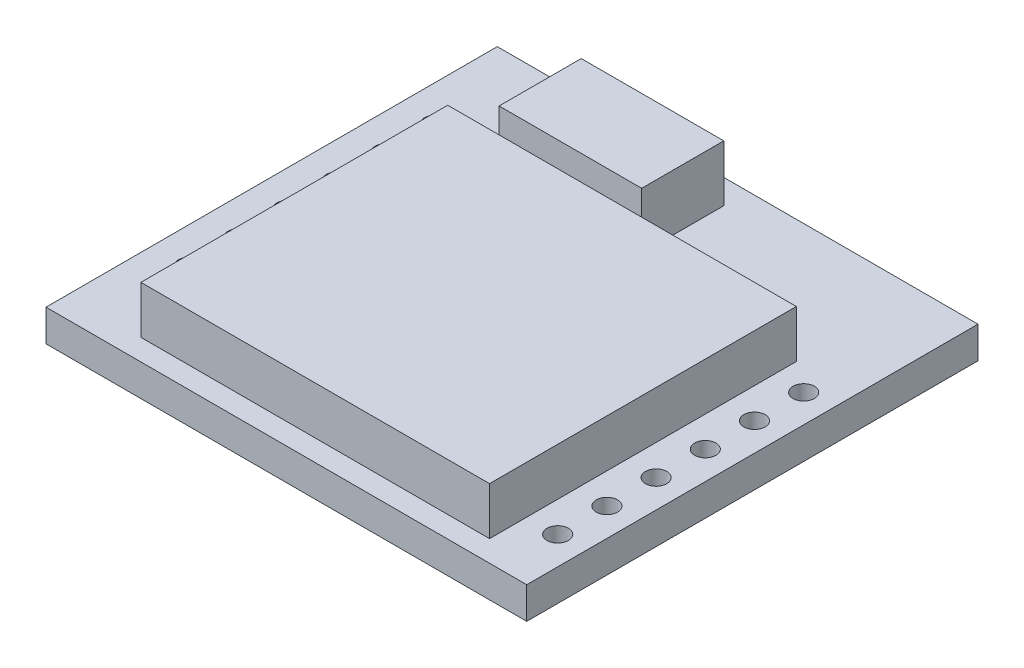
ISO-10303-21;
HEADER;
FILE_DESCRIPTION(('STEP AP214'),'2;1');
FILE_NAME('part.step','',(''),(''),'','','');
FILE_SCHEMA(('AUTOMOTIVE_DESIGN { 1 0 10303 214 1 1 1 1 }'));
ENDSEC;
DATA;
#1=APPLICATION_CONTEXT('core data for automotive mechanical design processes');
#2=APPLICATION_PROTOCOL_DEFINITION('international standard','automotive_design',2000,#1);
#3=PRODUCT_CONTEXT('',#1,'mechanical');
#4=PRODUCT('Part','Part','',(#3));
#5=PRODUCT_RELATED_PRODUCT_CATEGORY('part','',(#4));
#6=PRODUCT_DEFINITION_FORMATION('','',#4);
#7=PRODUCT_DEFINITION_CONTEXT('part definition',#1,'design');
#8=PRODUCT_DEFINITION('design','',#6,#7);
#9=PRODUCT_DEFINITION_SHAPE('','',#8);
#10=(LENGTH_UNIT() NAMED_UNIT(*) SI_UNIT(.MILLI.,.METRE.));
#11=(NAMED_UNIT(*) PLANE_ANGLE_UNIT() SI_UNIT($,.RADIAN.));
#12=(NAMED_UNIT(*) SI_UNIT($,.STERADIAN.) SOLID_ANGLE_UNIT());
#13=UNCERTAINTY_MEASURE_WITH_UNIT(LENGTH_MEASURE(1.E-05),#10,'distance_accuracy_value','');
#14=(GEOMETRIC_REPRESENTATION_CONTEXT(3) GLOBAL_UNCERTAINTY_ASSIGNED_CONTEXT((#13)) GLOBAL_UNIT_ASSIGNED_CONTEXT((#10,
#11,#12)) REPRESENTATION_CONTEXT('',''));
#15=CARTESIAN_POINT('',(0.,0.,0.));
#16=DIRECTION('',(0.,0.,1.));
#17=DIRECTION('',(1.,0.,0.));
#18=AXIS2_PLACEMENT_3D('',#15,#16,#17);
#19=CARTESIAN_POINT('',(0.,0.,0.));
#20=DIRECTION('',(0.,-1.,0.));
#21=DIRECTION('',(0.,0.,-1.));
#22=AXIS2_PLACEMENT_3D('',#19,#20,#21);
#23=PLANE('',#22);
#24=CARTESIAN_POINT('',(23.37,0.,-15.75));
#25=DIRECTION('',(0.,1.,0.));
#26=DIRECTION('',(0.,0.,1.));
#27=AXIS2_PLACEMENT_3D('',#24,#25,#26);
#28=CIRCLE('',#27,0.55);
#29=CARTESIAN_POINT('',(23.37,0.,-15.2));
#30=VERTEX_POINT('',#29);
#31=EDGE_CURVE('E333',#30,#30,#28,.T.);
#32=ORIENTED_EDGE('',*,*,#31,.T.);
#33=EDGE_LOOP('',(#32));
#34=FACE_BOUND('',#33,.T.);
#35=CARTESIAN_POINT('',(23.37,0.,-13.21));
#36=DIRECTION('',(0.,1.,0.));
#37=DIRECTION('',(0.,0.,1.));
#38=AXIS2_PLACEMENT_3D('',#35,#36,#37);
#39=CIRCLE('',#38,0.55);
#40=CARTESIAN_POINT('',(23.37,0.,-12.66));
#41=VERTEX_POINT('',#40);
#42=EDGE_CURVE('E321',#41,#41,#39,.T.);
#43=ORIENTED_EDGE('',*,*,#42,.T.);
#44=EDGE_LOOP('',(#43));
#45=FACE_BOUND('',#44,.T.);
#46=CARTESIAN_POINT('',(23.37,0.,-10.67));
#47=DIRECTION('',(0.,1.,0.));
#48=DIRECTION('',(0.,0.,1.));
#49=AXIS2_PLACEMENT_3D('',#46,#47,#48);
#50=CIRCLE('',#49,0.55);
#51=CARTESIAN_POINT('',(23.37,0.,-10.12));
#52=VERTEX_POINT('',#51);
#53=EDGE_CURVE('E309',#52,#52,#50,.T.);
#54=ORIENTED_EDGE('',*,*,#53,.T.);
#55=EDGE_LOOP('',(#54));
#56=FACE_BOUND('',#55,.T.);
#57=CARTESIAN_POINT('',(23.37,0.,-8.13));
#58=DIRECTION('',(0.,1.,0.));
#59=DIRECTION('',(0.,0.,1.));
#60=AXIS2_PLACEMENT_3D('',#57,#58,#59);
#61=CIRCLE('',#60,0.549999999999999);
#62=CARTESIAN_POINT('',(23.37,0.,-7.58));
#63=VERTEX_POINT('',#62);
#64=EDGE_CURVE('E297',#63,#63,#61,.T.);
#65=ORIENTED_EDGE('',*,*,#64,.T.);
#66=EDGE_LOOP('',(#65));
#67=FACE_BOUND('',#66,.T.);
#68=CARTESIAN_POINT('',(23.37,0.,-5.59));
#69=DIRECTION('',(0.,1.,0.));
#70=DIRECTION('',(0.,0.,1.));
#71=AXIS2_PLACEMENT_3D('',#68,#69,#70);
#72=CIRCLE('',#71,0.549999999999999);
#73=CARTESIAN_POINT('',(23.37,0.,-5.04));
#74=VERTEX_POINT('',#73);
#75=EDGE_CURVE('E285',#74,#74,#72,.T.);
#76=ORIENTED_EDGE('',*,*,#75,.T.);
#77=EDGE_LOOP('',(#76));
#78=FACE_BOUND('',#77,.T.);
#79=CARTESIAN_POINT('',(23.37,0.,-3.05));
#80=DIRECTION('',(0.,1.,0.));
#81=DIRECTION('',(0.,0.,1.));
#82=AXIS2_PLACEMENT_3D('',#79,#80,#81);
#83=CIRCLE('',#82,0.549999999999999);
#84=CARTESIAN_POINT('',(23.37,0.,-2.5));
#85=VERTEX_POINT('',#84);
#86=EDGE_CURVE('E273',#85,#85,#83,.T.);
#87=ORIENTED_EDGE('',*,*,#86,.T.);
#88=EDGE_LOOP('',(#87));
#89=FACE_BOUND('',#88,.T.);
#90=CARTESIAN_POINT('',(1.85,0.,-5.55));
#91=DIRECTION('',(0.,1.,0.));
#92=DIRECTION('',(0.,0.,1.));
#93=AXIS2_PLACEMENT_3D('',#90,#91,#92);
#94=CIRCLE('',#93,0.55);
#95=CARTESIAN_POINT('',(1.85,0.,-5.));
#96=VERTEX_POINT('',#95);
#97=EDGE_CURVE('E267',#96,#96,#94,.T.);
#98=ORIENTED_EDGE('',*,*,#97,.T.);
#99=EDGE_LOOP('',(#98));
#100=FACE_BOUND('',#99,.T.);
#101=CARTESIAN_POINT('',(1.84999999999999,0.,-8.09));
#102=DIRECTION('',(0.,1.,0.));
#103=DIRECTION('',(0.,0.,1.));
#104=AXIS2_PLACEMENT_3D('',#101,#102,#103);
#105=CIRCLE('',#104,0.55);
#106=CARTESIAN_POINT('',(1.84999999999999,0.,-7.54));
#107=VERTEX_POINT('',#106);
#108=EDGE_CURVE('E279',#107,#107,#105,.T.);
#109=ORIENTED_EDGE('',*,*,#108,.T.);
#110=EDGE_LOOP('',(#109));
#111=FACE_BOUND('',#110,.T.);
#112=CARTESIAN_POINT('',(1.84999999999998,0.,-10.63));
#113=DIRECTION('',(0.,1.,0.));
#114=DIRECTION('',(0.,0.,1.));
#115=AXIS2_PLACEMENT_3D('',#112,#113,#114);
#116=CIRCLE('',#115,0.549999999999999);
#117=CARTESIAN_POINT('',(1.84999999999998,0.,-10.08));
#118=VERTEX_POINT('',#117);
#119=EDGE_CURVE('E291',#118,#118,#116,.T.);
#120=ORIENTED_EDGE('',*,*,#119,.T.);
#121=EDGE_LOOP('',(#120));
#122=FACE_BOUND('',#121,.T.);
#123=CARTESIAN_POINT('',(1.84999999999997,0.,-13.17));
#124=DIRECTION('',(0.,1.,0.));
#125=DIRECTION('',(0.,0.,1.));
#126=AXIS2_PLACEMENT_3D('',#123,#124,#125);
#127=CIRCLE('',#126,0.55);
#128=CARTESIAN_POINT('',(1.84999999999997,0.,-12.62));
#129=VERTEX_POINT('',#128);
#130=EDGE_CURVE('E303',#129,#129,#127,.T.);
#131=ORIENTED_EDGE('',*,*,#130,.T.);
#132=EDGE_LOOP('',(#131));
#133=FACE_BOUND('',#132,.T.);
#134=CARTESIAN_POINT('',(1.84999999999996,0.,-15.71));
#135=DIRECTION('',(0.,1.,0.));
#136=DIRECTION('',(0.,0.,1.));
#137=AXIS2_PLACEMENT_3D('',#134,#135,#136);
#138=CIRCLE('',#137,0.549999999999999);
#139=CARTESIAN_POINT('',(1.84999999999996,0.,-15.16));
#140=VERTEX_POINT('',#139);
#141=EDGE_CURVE('E315',#140,#140,#138,.T.);
#142=ORIENTED_EDGE('',*,*,#141,.T.);
#143=EDGE_LOOP('',(#142));
#144=FACE_BOUND('',#143,.T.);
#145=CARTESIAN_POINT('',(1.84999999999996,0.,-18.25));
#146=DIRECTION('',(0.,1.,0.));
#147=DIRECTION('',(0.,0.,1.));
#148=AXIS2_PLACEMENT_3D('',#145,#146,#147);
#149=CIRCLE('',#148,0.549999999999999);
#150=CARTESIAN_POINT('',(1.84999999999996,0.,-17.7));
#151=VERTEX_POINT('',#150);
#152=EDGE_CURVE('E327',#151,#151,#149,.T.);
#153=ORIENTED_EDGE('',*,*,#152,.T.);
#154=EDGE_LOOP('',(#153));
#155=FACE_BOUND('',#154,.T.);
#156=DIRECTION('',(-1.,0.,0.));
#157=VECTOR('',#156,1.);
#158=CARTESIAN_POINT('',(0.,0.,-6.20000000000001));
#159=LINE('',#158,#157);
#160=CARTESIAN_POINT('',(20.22,0.,-6.2));
#161=VERTEX_POINT('',#160);
#162=CARTESIAN_POINT('',(15.72,0.,-6.2));
#163=VERTEX_POINT('',#162);
#164=EDGE_CURVE('E204',#161,#163,#159,.T.);
#165=ORIENTED_EDGE('',*,*,#164,.F.);
#166=DIRECTION('',(0.,0.,-1.));
#167=VECTOR('',#166,1.);
#168=CARTESIAN_POINT('',(20.22,0.,0.));
#169=LINE('',#168,#167);
#170=CARTESIAN_POINT('',(20.22,0.,-23.3));
#171=VERTEX_POINT('',#170);
#172=EDGE_CURVE('E174',#161,#171,#169,.T.);
#173=ORIENTED_EDGE('',*,*,#172,.T.);
#174=DIRECTION('',(-1.,0.,0.));
#175=VECTOR('',#174,1.);
#176=CARTESIAN_POINT('',(0.,0.,-23.3));
#177=LINE('',#176,#175);
#178=CARTESIAN_POINT('',(24.82,0.,-23.3));
#179=VERTEX_POINT('',#178);
#180=EDGE_CURVE('E228',#179,#171,#177,.T.);
#181=ORIENTED_EDGE('',*,*,#180,.F.);
#182=DIRECTION('',(0.,0.,-1.));
#183=VECTOR('',#182,1.);
#184=CARTESIAN_POINT('',(24.82,0.,0.));
#185=LINE('',#184,#183);
#186=CARTESIAN_POINT('',(24.82,0.,0.));
#187=VERTEX_POINT('',#186);
#188=EDGE_CURVE('E229',#187,#179,#185,.T.);
#189=ORIENTED_EDGE('',*,*,#188,.F.);
#190=DIRECTION('',(1.,0.,0.));
#191=VECTOR('',#190,1.);
#192=CARTESIAN_POINT('',(0.,0.,0.));
#193=LINE('',#192,#191);
#194=CARTESIAN_POINT('',(0.,0.,0.));
#195=VERTEX_POINT('',#194);
#196=EDGE_CURVE('E253',#195,#187,#193,.T.);
#197=ORIENTED_EDGE('',*,*,#196,.F.);
#198=DIRECTION('',(0.,0.,1.));
#199=VECTOR('',#198,1.);
#200=CARTESIAN_POINT('',(0.,0.,0.));
#201=LINE('',#200,#199);
#202=CARTESIAN_POINT('',(0.,0.,-23.3));
#203=VERTEX_POINT('',#202);
#204=EDGE_CURVE('E255',#203,#195,#201,.T.);
#205=ORIENTED_EDGE('',*,*,#204,.F.);
#206=CARTESIAN_POINT('',(4.92,0.,-23.3));
#207=VERTEX_POINT('',#206);
#208=EDGE_CURVE('E225',#207,#203,#177,.T.);
#209=ORIENTED_EDGE('',*,*,#208,.F.);
#210=DIRECTION('',(0.,0.,-1.));
#211=VECTOR('',#210,1.);
#212=CARTESIAN_POINT('',(4.92,0.,0.));
#213=LINE('',#212,#211);
#214=CARTESIAN_POINT('',(4.92,0.,-7.6));
#215=VERTEX_POINT('',#214);
#216=EDGE_CURVE('E58',#215,#207,#213,.T.);
#217=ORIENTED_EDGE('',*,*,#216,.F.);
#218=DIRECTION('',(1.,0.,0.));
#219=VECTOR('',#218,1.);
#220=CARTESIAN_POINT('',(0.,0.,-7.6));
#221=LINE('',#220,#219);
#222=CARTESIAN_POINT('',(15.72,0.,-7.6));
#223=VERTEX_POINT('',#222);
#224=EDGE_CURVE('E63',#215,#223,#221,.T.);
#225=ORIENTED_EDGE('',*,*,#224,.T.);
#226=DIRECTION('',(0.,0.,1.));
#227=VECTOR('',#226,1.);
#228=CARTESIAN_POINT('',(15.72,0.,0.));
#229=LINE('',#228,#227);
#230=EDGE_CURVE('E206',#223,#163,#229,.T.);
#231=ORIENTED_EDGE('',*,*,#230,.T.);
#232=EDGE_LOOP('',(#165,#173,#181,#189,#197,#205,#209,#217,#225,#231));
#233=FACE_BOUND('',#232,.T.);
#234=ADVANCED_FACE('F41',(#34,#45,#56,#67,#78,#89,#100,#111,#122,#133,#144,#155,#233),#23,.T.);
#235=CARTESIAN_POINT('',(0.,1.64,0.));
#236=DIRECTION('',(0.,-1.,0.));
#237=DIRECTION('',(0.,0.,-1.));
#238=AXIS2_PLACEMENT_3D('',#235,#236,#237);
#239=PLANE('',#238);
#240=DIRECTION('',(0.,0.,1.));
#241=VECTOR('',#240,1.);
#242=CARTESIAN_POINT('',(3.8,1.64,-16.94));
#243=LINE('',#242,#241);
#244=CARTESIAN_POINT('',(3.8,1.64,-16.94));
#245=VERTEX_POINT('',#244);
#246=CARTESIAN_POINT('',(3.8,1.64,-1.1));
#247=VERTEX_POINT('',#246);
#248=EDGE_CURVE('E361',#245,#247,#243,.T.);
#249=ORIENTED_EDGE('',*,*,#248,.F.);
#250=DIRECTION('',(-1.,0.,0.));
#251=VECTOR('',#250,1.);
#252=CARTESIAN_POINT('',(3.8,1.64,-16.94));
#253=LINE('',#252,#251);
#254=CARTESIAN_POINT('',(21.8,1.64,-16.94));
#255=VERTEX_POINT('',#254);
#256=EDGE_CURVE('E351',#255,#245,#253,.T.);
#257=ORIENTED_EDGE('',*,*,#256,.F.);
#258=DIRECTION('',(0.,0.,-1.));
#259=VECTOR('',#258,1.);
#260=CARTESIAN_POINT('',(21.8,1.64,-16.94));
#261=LINE('',#260,#259);
#262=CARTESIAN_POINT('',(21.8,1.64,-1.1));
#263=VERTEX_POINT('',#262);
#264=EDGE_CURVE('E355',#263,#255,#261,.T.);
#265=ORIENTED_EDGE('',*,*,#264,.F.);
#266=DIRECTION('',(1.,0.,0.));
#267=VECTOR('',#266,1.);
#268=CARTESIAN_POINT('',(3.8,1.64,-1.1));
#269=LINE('',#268,#267);
#270=EDGE_CURVE('E358',#247,#263,#269,.T.);
#271=ORIENTED_EDGE('',*,*,#270,.F.);
#272=EDGE_LOOP('',(#249,#257,#265,#271));
#273=FACE_BOUND('',#272,.T.);
#274=CARTESIAN_POINT('',(1.84999999999996,1.64,-18.25));
#275=DIRECTION('',(0.,1.,0.));
#276=DIRECTION('',(0.,0.,1.));
#277=AXIS2_PLACEMENT_3D('',#274,#275,#276);
#278=CIRCLE('',#277,0.549999999999999);
#279=CARTESIAN_POINT('',(1.84999999999996,1.64,-17.7));
#280=VERTEX_POINT('',#279);
#281=EDGE_CURVE('E324',#280,#280,#278,.T.);
#282=ORIENTED_EDGE('',*,*,#281,.F.);
#283=EDGE_LOOP('',(#282));
#284=FACE_BOUND('',#283,.T.);
#285=CARTESIAN_POINT('',(1.84999999999996,1.64,-15.71));
#286=DIRECTION('',(0.,1.,0.));
#287=DIRECTION('',(0.,0.,1.));
#288=AXIS2_PLACEMENT_3D('',#285,#286,#287);
#289=CIRCLE('',#288,0.549999999999999);
#290=CARTESIAN_POINT('',(1.84999999999996,1.64,-15.16));
#291=VERTEX_POINT('',#290);
#292=EDGE_CURVE('E312',#291,#291,#289,.T.);
#293=ORIENTED_EDGE('',*,*,#292,.F.);
#294=EDGE_LOOP('',(#293));
#295=FACE_BOUND('',#294,.T.);
#296=CARTESIAN_POINT('',(1.84999999999997,1.64,-13.17));
#297=DIRECTION('',(0.,1.,0.));
#298=DIRECTION('',(0.,0.,1.));
#299=AXIS2_PLACEMENT_3D('',#296,#297,#298);
#300=CIRCLE('',#299,0.55);
#301=CARTESIAN_POINT('',(1.84999999999997,1.64,-12.62));
#302=VERTEX_POINT('',#301);
#303=EDGE_CURVE('E300',#302,#302,#300,.T.);
#304=ORIENTED_EDGE('',*,*,#303,.F.);
#305=EDGE_LOOP('',(#304));
#306=FACE_BOUND('',#305,.T.);
#307=CARTESIAN_POINT('',(1.84999999999998,1.64,-10.63));
#308=DIRECTION('',(0.,1.,0.));
#309=DIRECTION('',(0.,0.,1.));
#310=AXIS2_PLACEMENT_3D('',#307,#308,#309);
#311=CIRCLE('',#310,0.549999999999999);
#312=CARTESIAN_POINT('',(1.84999999999998,1.64,-10.08));
#313=VERTEX_POINT('',#312);
#314=EDGE_CURVE('E288',#313,#313,#311,.T.);
#315=ORIENTED_EDGE('',*,*,#314,.F.);
#316=EDGE_LOOP('',(#315));
#317=FACE_BOUND('',#316,.T.);
#318=CARTESIAN_POINT('',(1.84999999999999,1.64,-8.09));
#319=DIRECTION('',(0.,1.,0.));
#320=DIRECTION('',(0.,0.,1.));
#321=AXIS2_PLACEMENT_3D('',#318,#319,#320);
#322=CIRCLE('',#321,0.55);
#323=CARTESIAN_POINT('',(1.84999999999999,1.64,-7.54));
#324=VERTEX_POINT('',#323);
#325=EDGE_CURVE('E276',#324,#324,#322,.T.);
#326=ORIENTED_EDGE('',*,*,#325,.F.);
#327=EDGE_LOOP('',(#326));
#328=FACE_BOUND('',#327,.T.);
#329=CARTESIAN_POINT('',(1.85,1.64,-5.55));
#330=DIRECTION('',(0.,1.,0.));
#331=DIRECTION('',(0.,0.,1.));
#332=AXIS2_PLACEMENT_3D('',#329,#330,#331);
#333=CIRCLE('',#332,0.55);
#334=CARTESIAN_POINT('',(1.85,1.64,-5.));
#335=VERTEX_POINT('',#334);
#336=EDGE_CURVE('E257',#335,#335,#333,.T.);
#337=ORIENTED_EDGE('',*,*,#336,.F.);
#338=EDGE_LOOP('',(#337));
#339=FACE_BOUND('',#338,.T.);
#340=DIRECTION('',(0.,0.,1.));
#341=VECTOR('',#340,1.);
#342=CARTESIAN_POINT('',(0.,1.64,0.));
#343=LINE('',#342,#341);
#344=CARTESIAN_POINT('',(0.,1.64,-23.3));
#345=VERTEX_POINT('',#344);
#346=CARTESIAN_POINT('',(0.,1.64,0.));
#347=VERTEX_POINT('',#346);
#348=EDGE_CURVE('E264',#345,#347,#343,.T.);
#349=ORIENTED_EDGE('',*,*,#348,.T.);
#350=DIRECTION('',(1.,0.,0.));
#351=VECTOR('',#350,1.);
#352=CARTESIAN_POINT('',(0.,1.64,0.));
#353=LINE('',#352,#351);
#354=CARTESIAN_POINT('',(24.82,1.64,0.));
#355=VERTEX_POINT('',#354);
#356=EDGE_CURVE('E262',#347,#355,#353,.T.);
#357=ORIENTED_EDGE('',*,*,#356,.T.);
#358=DIRECTION('',(0.,0.,-1.));
#359=VECTOR('',#358,1.);
#360=CARTESIAN_POINT('',(24.82,1.64,0.));
#361=LINE('',#360,#359);
#362=CARTESIAN_POINT('',(24.82,1.64,-23.3));
#363=VERTEX_POINT('',#362);
#364=EDGE_CURVE('E249',#355,#363,#361,.T.);
#365=ORIENTED_EDGE('',*,*,#364,.T.);
#366=DIRECTION('',(-1.,0.,0.));
#367=VECTOR('',#366,1.);
#368=CARTESIAN_POINT('',(0.,1.64,-23.3));
#369=LINE('',#368,#367);
#370=EDGE_CURVE('E239',#363,#345,#369,.T.);
#371=ORIENTED_EDGE('',*,*,#370,.T.);
#372=EDGE_LOOP('',(#349,#357,#365,#371));
#373=FACE_BOUND('',#372,.T.);
#374=CARTESIAN_POINT('',(23.37,1.64,-3.05));
#375=DIRECTION('',(0.,1.,0.));
#376=DIRECTION('',(0.,0.,1.));
#377=AXIS2_PLACEMENT_3D('',#374,#375,#376);
#378=CIRCLE('',#377,0.549999999999999);
#379=CARTESIAN_POINT('',(23.37,1.64,-2.5));
#380=VERTEX_POINT('',#379);
#381=EDGE_CURVE('E270',#380,#380,#378,.T.);
#382=ORIENTED_EDGE('',*,*,#381,.F.);
#383=EDGE_LOOP('',(#382));
#384=FACE_BOUND('',#383,.T.);
#385=CARTESIAN_POINT('',(23.37,1.64,-5.59));
#386=DIRECTION('',(0.,1.,0.));
#387=DIRECTION('',(0.,0.,1.));
#388=AXIS2_PLACEMENT_3D('',#385,#386,#387);
#389=CIRCLE('',#388,0.549999999999999);
#390=CARTESIAN_POINT('',(23.37,1.64,-5.04));
#391=VERTEX_POINT('',#390);
#392=EDGE_CURVE('E282',#391,#391,#389,.T.);
#393=ORIENTED_EDGE('',*,*,#392,.F.);
#394=EDGE_LOOP('',(#393));
#395=FACE_BOUND('',#394,.T.);
#396=CARTESIAN_POINT('',(23.37,1.64,-8.13));
#397=DIRECTION('',(0.,1.,0.));
#398=DIRECTION('',(0.,0.,1.));
#399=AXIS2_PLACEMENT_3D('',#396,#397,#398);
#400=CIRCLE('',#399,0.549999999999999);
#401=CARTESIAN_POINT('',(23.37,1.64,-7.58));
#402=VERTEX_POINT('',#401);
#403=EDGE_CURVE('E294',#402,#402,#400,.T.);
#404=ORIENTED_EDGE('',*,*,#403,.F.);
#405=EDGE_LOOP('',(#404));
#406=FACE_BOUND('',#405,.T.);
#407=CARTESIAN_POINT('',(23.37,1.64,-10.67));
#408=DIRECTION('',(0.,1.,0.));
#409=DIRECTION('',(0.,0.,1.));
#410=AXIS2_PLACEMENT_3D('',#407,#408,#409);
#411=CIRCLE('',#410,0.55);
#412=CARTESIAN_POINT('',(23.37,1.64,-10.12));
#413=VERTEX_POINT('',#412);
#414=EDGE_CURVE('E306',#413,#413,#411,.T.);
#415=ORIENTED_EDGE('',*,*,#414,.F.);
#416=EDGE_LOOP('',(#415));
#417=FACE_BOUND('',#416,.T.);
#418=CARTESIAN_POINT('',(23.37,1.64,-13.21));
#419=DIRECTION('',(0.,1.,0.));
#420=DIRECTION('',(0.,0.,1.));
#421=AXIS2_PLACEMENT_3D('',#418,#419,#420);
#422=CIRCLE('',#421,0.55);
#423=CARTESIAN_POINT('',(23.37,1.64,-12.66));
#424=VERTEX_POINT('',#423);
#425=EDGE_CURVE('E318',#424,#424,#422,.T.);
#426=ORIENTED_EDGE('',*,*,#425,.F.);
#427=EDGE_LOOP('',(#426));
#428=FACE_BOUND('',#427,.T.);
#429=CARTESIAN_POINT('',(23.37,1.64,-15.75));
#430=DIRECTION('',(0.,1.,0.));
#431=DIRECTION('',(0.,0.,1.));
#432=AXIS2_PLACEMENT_3D('',#429,#430,#431);
#433=CIRCLE('',#432,0.55);
#434=CARTESIAN_POINT('',(23.37,1.64,-15.2));
#435=VERTEX_POINT('',#434);
#436=EDGE_CURVE('E330',#435,#435,#433,.T.);
#437=ORIENTED_EDGE('',*,*,#436,.F.);
#438=EDGE_LOOP('',(#437));
#439=FACE_BOUND('',#438,.T.);
#440=DIRECTION('',(0.,0.,1.));
#441=VECTOR('',#440,1.);
#442=CARTESIAN_POINT('',(5.60140526925351,1.64,-22.0343415862834));
#443=LINE('',#442,#441);
#444=CARTESIAN_POINT('',(5.60140526925351,1.64,-22.0343415862834));
#445=VERTEX_POINT('',#444);
#446=CARTESIAN_POINT('',(5.60140526925351,1.64,-17.7943415862834));
#447=VERTEX_POINT('',#446);
#448=EDGE_CURVE('E177',#445,#447,#443,.T.);
#449=ORIENTED_EDGE('',*,*,#448,.F.);
#450=DIRECTION('',(-1.,0.,0.));
#451=VECTOR('',#450,1.);
#452=CARTESIAN_POINT('',(5.60140526925351,1.64,-22.0343415862834));
#453=LINE('',#452,#451);
#454=CARTESIAN_POINT('',(12.9614052692535,1.64,-22.0343415862834));
#455=VERTEX_POINT('',#454);
#456=EDGE_CURVE('E384',#455,#445,#453,.T.);
#457=ORIENTED_EDGE('',*,*,#456,.F.);
#458=DIRECTION('',(0.,0.,-1.));
#459=VECTOR('',#458,1.);
#460=CARTESIAN_POINT('',(12.9614052692535,1.64,-22.0343415862834));
#461=LINE('',#460,#459);
#462=CARTESIAN_POINT('',(12.9614052692535,1.64,-17.7943415862834));
#463=VERTEX_POINT('',#462);
#464=EDGE_CURVE('E388',#463,#455,#461,.T.);
#465=ORIENTED_EDGE('',*,*,#464,.F.);
#466=DIRECTION('',(1.,0.,0.));
#467=VECTOR('',#466,1.);
#468=CARTESIAN_POINT('',(5.60140526925351,1.64,-17.7943415862834));
#469=LINE('',#468,#467);
#470=EDGE_CURVE('E391',#447,#463,#469,.T.);
#471=ORIENTED_EDGE('',*,*,#470,.F.);
#472=EDGE_LOOP('',(#449,#457,#465,#471));
#473=FACE_BOUND('',#472,.T.);
#474=ADVANCED_FACE('F414',(#273,#284,#295,#306,#317,#328,#339,#373,#384,#395,#406,#417,#428,
#439,#473),#239,.F.);
#475=CARTESIAN_POINT('',(0.,1.64,0.));
#476=DIRECTION('',(1.,0.,0.));
#477=DIRECTION('',(0.,0.,-1.));
#478=AXIS2_PLACEMENT_3D('',#475,#476,#477);
#479=PLANE('',#478);
#480=ORIENTED_EDGE('',*,*,#204,.T.);
#481=DIRECTION('',(0.,-1.,0.));
#482=VECTOR('',#481,1.);
#483=CARTESIAN_POINT('',(0.,1.64,0.));
#484=LINE('',#483,#482);
#485=EDGE_CURVE('E11',#347,#195,#484,.T.);
#486=ORIENTED_EDGE('',*,*,#485,.F.);
#487=ORIENTED_EDGE('',*,*,#348,.F.);
#488=DIRECTION('',(0.,-1.,0.));
#489=VECTOR('',#488,1.);
#490=CARTESIAN_POINT('',(0.,1.64,-23.3));
#491=LINE('',#490,#489);
#492=EDGE_CURVE('E234',#345,#203,#491,.T.);
#493=ORIENTED_EDGE('',*,*,#492,.T.);
#494=EDGE_LOOP('',(#480,#486,#487,#493));
#495=FACE_BOUND('',#494,.T.);
#496=ADVANCED_FACE('F43',(#495),#479,.F.);
#497=CARTESIAN_POINT('',(0.,1.64,0.));
#498=DIRECTION('',(0.,0.,-1.));
#499=DIRECTION('',(-1.,0.,0.));
#500=AXIS2_PLACEMENT_3D('',#497,#498,#499);
#501=PLANE('',#500);
#502=ORIENTED_EDGE('',*,*,#196,.T.);
#503=DIRECTION('',(0.,-1.,0.));
#504=VECTOR('',#503,1.);
#505=CARTESIAN_POINT('',(24.82,1.64,0.));
#506=LINE('',#505,#504);
#507=EDGE_CURVE('E50',#355,#187,#506,.T.);
#508=ORIENTED_EDGE('',*,*,#507,.F.);
#509=ORIENTED_EDGE('',*,*,#356,.F.);
#510=ORIENTED_EDGE('',*,*,#485,.T.);
#511=EDGE_LOOP('',(#502,#508,#509,#510));
#512=FACE_BOUND('',#511,.T.);
#513=ADVANCED_FACE('F417',(#512),#501,.F.);
#514=CARTESIAN_POINT('',(24.82,1.64,0.));
#515=DIRECTION('',(-1.,0.,0.));
#516=DIRECTION('',(0.,0.,1.));
#517=AXIS2_PLACEMENT_3D('',#514,#515,#516);
#518=PLANE('',#517);
#519=ORIENTED_EDGE('',*,*,#188,.T.);
#520=DIRECTION('',(0.,-1.,0.));
#521=VECTOR('',#520,1.);
#522=CARTESIAN_POINT('',(24.82,1.64,-23.3));
#523=LINE('',#522,#521);
#524=EDGE_CURVE('E238',#363,#179,#523,.T.);
#525=ORIENTED_EDGE('',*,*,#524,.F.);
#526=ORIENTED_EDGE('',*,*,#364,.F.);
#527=ORIENTED_EDGE('',*,*,#507,.T.);
#528=EDGE_LOOP('',(#519,#525,#526,#527));
#529=FACE_BOUND('',#528,.T.);
#530=ADVANCED_FACE('F247',(#529),#518,.F.);
#531=CARTESIAN_POINT('',(0.,1.64,-23.3));
#532=DIRECTION('',(0.,0.,1.));
#533=DIRECTION('',(1.,0.,0.));
#534=AXIS2_PLACEMENT_3D('',#531,#532,#533);
#535=PLANE('',#534);
#536=ORIENTED_EDGE('',*,*,#180,.T.);
#537=DIRECTION('',(0.,1.,0.));
#538=VECTOR('',#537,1.);
#539=CARTESIAN_POINT('',(20.22,-1.4,-23.3));
#540=LINE('',#539,#538);
#541=CARTESIAN_POINT('',(20.22,-1.4,-23.3));
#542=VERTEX_POINT('',#541);
#543=EDGE_CURVE('E203',#542,#171,#540,.T.);
#544=ORIENTED_EDGE('',*,*,#543,.F.);
#545=DIRECTION('',(1.,0.,0.));
#546=VECTOR('',#545,1.);
#547=CARTESIAN_POINT('',(0.,-1.4,-23.3));
#548=LINE('',#547,#546);
#549=CARTESIAN_POINT('',(4.92,-1.4,-23.3));
#550=VERTEX_POINT('',#549);
#551=EDGE_CURVE('E191',#550,#542,#548,.T.);
#552=ORIENTED_EDGE('',*,*,#551,.F.);
#553=DIRECTION('',(0.,1.,0.));
#554=VECTOR('',#553,1.);
#555=CARTESIAN_POINT('',(4.92,-1.4,-23.3));
#556=LINE('',#555,#554);
#557=EDGE_CURVE('E216',#550,#207,#556,.T.);
#558=ORIENTED_EDGE('',*,*,#557,.T.);
#559=ORIENTED_EDGE('',*,*,#208,.T.);
#560=ORIENTED_EDGE('',*,*,#492,.F.);
#561=ORIENTED_EDGE('',*,*,#370,.F.);
#562=ORIENTED_EDGE('',*,*,#524,.T.);
#563=EDGE_LOOP('',(#536,#544,#552,#558,#559,#560,#561,#562));
#564=FACE_BOUND('',#563,.T.);
#565=ADVANCED_FACE('F409',(#564),#535,.F.);
#566=CARTESIAN_POINT('',(1.85,1.64,-5.55));
#567=DIRECTION('',(0.,-1.,0.));
#568=DIRECTION('',(0.,0.,-1.));
#569=AXIS2_PLACEMENT_3D('',#566,#567,#568);
#570=CYLINDRICAL_SURFACE('',#569,0.55);
#571=ORIENTED_EDGE('',*,*,#336,.T.);
#572=EDGE_LOOP('',(#571));
#573=FACE_BOUND('',#572,.T.);
#574=ORIENTED_EDGE('',*,*,#97,.F.);
#575=EDGE_LOOP('',(#574));
#576=FACE_BOUND('',#575,.T.);
#577=ADVANCED_FACE('F443',(#573,#576),#570,.F.);
#578=CARTESIAN_POINT('',(23.37,1.64,-3.05));
#579=DIRECTION('',(0.,-1.,0.));
#580=DIRECTION('',(0.,0.,-1.));
#581=AXIS2_PLACEMENT_3D('',#578,#579,#580);
#582=CYLINDRICAL_SURFACE('',#581,0.549999999999999);
#583=ORIENTED_EDGE('',*,*,#381,.T.);
#584=EDGE_LOOP('',(#583));
#585=FACE_BOUND('',#584,.T.);
#586=ORIENTED_EDGE('',*,*,#86,.F.);
#587=EDGE_LOOP('',(#586));
#588=FACE_BOUND('',#587,.T.);
#589=ADVANCED_FACE('F632',(#585,#588),#582,.F.);
#590=CARTESIAN_POINT('',(1.84999999999999,1.64,-8.09));
#591=DIRECTION('',(0.,-1.,0.));
#592=DIRECTION('',(0.,0.,-1.));
#593=AXIS2_PLACEMENT_3D('',#590,#591,#592);
#594=CYLINDRICAL_SURFACE('',#593,0.55);
#595=ORIENTED_EDGE('',*,*,#325,.T.);
#596=EDGE_LOOP('',(#595));
#597=FACE_BOUND('',#596,.T.);
#598=ORIENTED_EDGE('',*,*,#108,.F.);
#599=EDGE_LOOP('',(#598));
#600=FACE_BOUND('',#599,.T.);
#601=ADVANCED_FACE('F628',(#597,#600),#594,.F.);
#602=CARTESIAN_POINT('',(23.37,1.64,-5.59));
#603=DIRECTION('',(0.,-1.,0.));
#604=DIRECTION('',(0.,0.,-1.));
#605=AXIS2_PLACEMENT_3D('',#602,#603,#604);
#606=CYLINDRICAL_SURFACE('',#605,0.549999999999999);
#607=ORIENTED_EDGE('',*,*,#392,.T.);
#608=EDGE_LOOP('',(#607));
#609=FACE_BOUND('',#608,.T.);
#610=ORIENTED_EDGE('',*,*,#75,.F.);
#611=EDGE_LOOP('',(#610));
#612=FACE_BOUND('',#611,.T.);
#613=ADVANCED_FACE('F624',(#609,#612),#606,.F.);
#614=CARTESIAN_POINT('',(1.84999999999998,1.64,-10.63));
#615=DIRECTION('',(0.,-1.,0.));
#616=DIRECTION('',(0.,0.,-1.));
#617=AXIS2_PLACEMENT_3D('',#614,#615,#616);
#618=CYLINDRICAL_SURFACE('',#617,0.549999999999999);
#619=ORIENTED_EDGE('',*,*,#314,.T.);
#620=EDGE_LOOP('',(#619));
#621=FACE_BOUND('',#620,.T.);
#622=ORIENTED_EDGE('',*,*,#119,.F.);
#623=EDGE_LOOP('',(#622));
#624=FACE_BOUND('',#623,.T.);
#625=ADVANCED_FACE('F620',(#621,#624),#618,.F.);
#626=CARTESIAN_POINT('',(23.37,1.64,-8.13));
#627=DIRECTION('',(0.,-1.,0.));
#628=DIRECTION('',(0.,0.,-1.));
#629=AXIS2_PLACEMENT_3D('',#626,#627,#628);
#630=CYLINDRICAL_SURFACE('',#629,0.549999999999999);
#631=ORIENTED_EDGE('',*,*,#403,.T.);
#632=EDGE_LOOP('',(#631));
#633=FACE_BOUND('',#632,.T.);
#634=ORIENTED_EDGE('',*,*,#64,.F.);
#635=EDGE_LOOP('',(#634));
#636=FACE_BOUND('',#635,.T.);
#637=ADVANCED_FACE('F616',(#633,#636),#630,.F.);
#638=CARTESIAN_POINT('',(1.84999999999997,1.64,-13.17));
#639=DIRECTION('',(0.,-1.,0.));
#640=DIRECTION('',(0.,0.,-1.));
#641=AXIS2_PLACEMENT_3D('',#638,#639,#640);
#642=CYLINDRICAL_SURFACE('',#641,0.55);
#643=ORIENTED_EDGE('',*,*,#303,.T.);
#644=EDGE_LOOP('',(#643));
#645=FACE_BOUND('',#644,.T.);
#646=ORIENTED_EDGE('',*,*,#130,.F.);
#647=EDGE_LOOP('',(#646));
#648=FACE_BOUND('',#647,.T.);
#649=ADVANCED_FACE('F612',(#645,#648),#642,.F.);
#650=CARTESIAN_POINT('',(23.37,1.64,-10.67));
#651=DIRECTION('',(0.,-1.,0.));
#652=DIRECTION('',(0.,0.,-1.));
#653=AXIS2_PLACEMENT_3D('',#650,#651,#652);
#654=CYLINDRICAL_SURFACE('',#653,0.55);
#655=ORIENTED_EDGE('',*,*,#414,.T.);
#656=EDGE_LOOP('',(#655));
#657=FACE_BOUND('',#656,.T.);
#658=ORIENTED_EDGE('',*,*,#53,.F.);
#659=EDGE_LOOP('',(#658));
#660=FACE_BOUND('',#659,.T.);
#661=ADVANCED_FACE('F608',(#657,#660),#654,.F.);
#662=CARTESIAN_POINT('',(1.84999999999996,1.64,-15.71));
#663=DIRECTION('',(0.,-1.,0.));
#664=DIRECTION('',(0.,0.,-1.));
#665=AXIS2_PLACEMENT_3D('',#662,#663,#664);
#666=CYLINDRICAL_SURFACE('',#665,0.549999999999999);
#667=ORIENTED_EDGE('',*,*,#292,.T.);
#668=EDGE_LOOP('',(#667));
#669=FACE_BOUND('',#668,.T.);
#670=ORIENTED_EDGE('',*,*,#141,.F.);
#671=EDGE_LOOP('',(#670));
#672=FACE_BOUND('',#671,.T.);
#673=ADVANCED_FACE('F604',(#669,#672),#666,.F.);
#674=CARTESIAN_POINT('',(23.37,1.64,-13.21));
#675=DIRECTION('',(0.,-1.,0.));
#676=DIRECTION('',(0.,0.,-1.));
#677=AXIS2_PLACEMENT_3D('',#674,#675,#676);
#678=CYLINDRICAL_SURFACE('',#677,0.55);
#679=ORIENTED_EDGE('',*,*,#425,.T.);
#680=EDGE_LOOP('',(#679));
#681=FACE_BOUND('',#680,.T.);
#682=ORIENTED_EDGE('',*,*,#42,.F.);
#683=EDGE_LOOP('',(#682));
#684=FACE_BOUND('',#683,.T.);
#685=ADVANCED_FACE('F600',(#681,#684),#678,.F.);
#686=CARTESIAN_POINT('',(1.84999999999996,1.64,-18.25));
#687=DIRECTION('',(0.,-1.,0.));
#688=DIRECTION('',(0.,0.,-1.));
#689=AXIS2_PLACEMENT_3D('',#686,#687,#688);
#690=CYLINDRICAL_SURFACE('',#689,0.549999999999999);
#691=ORIENTED_EDGE('',*,*,#281,.T.);
#692=EDGE_LOOP('',(#691));
#693=FACE_BOUND('',#692,.T.);
#694=ORIENTED_EDGE('',*,*,#152,.F.);
#695=EDGE_LOOP('',(#694));
#696=FACE_BOUND('',#695,.T.);
#697=ADVANCED_FACE('F596',(#693,#696),#690,.F.);
#698=CARTESIAN_POINT('',(23.37,1.64,-15.75));
#699=DIRECTION('',(0.,-1.,0.));
#700=DIRECTION('',(0.,0.,-1.));
#701=AXIS2_PLACEMENT_3D('',#698,#699,#700);
#702=CYLINDRICAL_SURFACE('',#701,0.55);
#703=ORIENTED_EDGE('',*,*,#436,.T.);
#704=EDGE_LOOP('',(#703));
#705=FACE_BOUND('',#704,.T.);
#706=ORIENTED_EDGE('',*,*,#31,.F.);
#707=EDGE_LOOP('',(#706));
#708=FACE_BOUND('',#707,.T.);
#709=ADVANCED_FACE('F592',(#705,#708),#702,.F.);
#710=CARTESIAN_POINT('',(3.8,4.1,-16.94));
#711=DIRECTION('',(1.,0.,0.));
#712=DIRECTION('',(0.,0.,-1.));
#713=AXIS2_PLACEMENT_3D('',#710,#711,#712);
#714=PLANE('',#713);
#715=ORIENTED_EDGE('',*,*,#248,.T.);
#716=DIRECTION('',(0.,-1.,0.));
#717=VECTOR('',#716,1.);
#718=CARTESIAN_POINT('',(3.8,4.1,-1.1));
#719=LINE('',#718,#717);
#720=CARTESIAN_POINT('',(3.8,4.1,-1.1));
#721=VERTEX_POINT('',#720);
#722=EDGE_CURVE('E336',#721,#247,#719,.T.);
#723=ORIENTED_EDGE('',*,*,#722,.F.);
#724=DIRECTION('',(0.,0.,1.));
#725=VECTOR('',#724,1.);
#726=CARTESIAN_POINT('',(3.8,4.1,-16.94));
#727=LINE('',#726,#725);
#728=CARTESIAN_POINT('',(3.8,4.1,-16.94));
#729=VERTEX_POINT('',#728);
#730=EDGE_CURVE('E354',#729,#721,#727,.T.);
#731=ORIENTED_EDGE('',*,*,#730,.F.);
#732=DIRECTION('',(0.,-1.,0.));
#733=VECTOR('',#732,1.);
#734=CARTESIAN_POINT('',(3.8,4.1,-16.94));
#735=LINE('',#734,#733);
#736=EDGE_CURVE('E347',#729,#245,#735,.T.);
#737=ORIENTED_EDGE('',*,*,#736,.T.);
#738=EDGE_LOOP('',(#715,#723,#731,#737));
#739=FACE_BOUND('',#738,.T.);
#740=ADVANCED_FACE('F588',(#739),#714,.F.);
#741=CARTESIAN_POINT('',(3.8,4.1,-1.1));
#742=DIRECTION('',(0.,0.,-1.));
#743=DIRECTION('',(-1.,0.,0.));
#744=AXIS2_PLACEMENT_3D('',#741,#742,#743);
#745=PLANE('',#744);
#746=ORIENTED_EDGE('',*,*,#270,.T.);
#747=DIRECTION('',(0.,-1.,0.));
#748=VECTOR('',#747,1.);
#749=CARTESIAN_POINT('',(21.8,4.1,-1.1));
#750=LINE('',#749,#748);
#751=CARTESIAN_POINT('',(21.8,4.1,-1.1));
#752=VERTEX_POINT('',#751);
#753=EDGE_CURVE('E341',#752,#263,#750,.T.);
#754=ORIENTED_EDGE('',*,*,#753,.F.);
#755=DIRECTION('',(1.,0.,0.));
#756=VECTOR('',#755,1.);
#757=CARTESIAN_POINT('',(3.8,4.1,-1.1));
#758=LINE('',#757,#756);
#759=EDGE_CURVE('E368',#721,#752,#758,.T.);
#760=ORIENTED_EDGE('',*,*,#759,.F.);
#761=ORIENTED_EDGE('',*,*,#722,.T.);
#762=EDGE_LOOP('',(#746,#754,#760,#761));
#763=FACE_BOUND('',#762,.T.);
#764=ADVANCED_FACE('F584',(#763),#745,.F.);
#765=CARTESIAN_POINT('',(21.8,4.1,-16.94));
#766=DIRECTION('',(-1.,0.,0.));
#767=DIRECTION('',(0.,0.,1.));
#768=AXIS2_PLACEMENT_3D('',#765,#766,#767);
#769=PLANE('',#768);
#770=ORIENTED_EDGE('',*,*,#264,.T.);
#771=DIRECTION('',(0.,-1.,0.));
#772=VECTOR('',#771,1.);
#773=CARTESIAN_POINT('',(21.8,4.1,-16.94));
#774=LINE('',#773,#772);
#775=CARTESIAN_POINT('',(21.8,4.1,-16.94));
#776=VERTEX_POINT('',#775);
#777=EDGE_CURVE('E344',#776,#255,#774,.T.);
#778=ORIENTED_EDGE('',*,*,#777,.F.);
#779=DIRECTION('',(0.,0.,-1.));
#780=VECTOR('',#779,1.);
#781=CARTESIAN_POINT('',(21.8,4.1,-16.94));
#782=LINE('',#781,#780);
#783=EDGE_CURVE('E366',#752,#776,#782,.T.);
#784=ORIENTED_EDGE('',*,*,#783,.F.);
#785=ORIENTED_EDGE('',*,*,#753,.T.);
#786=EDGE_LOOP('',(#770,#778,#784,#785));
#787=FACE_BOUND('',#786,.T.);
#788=ADVANCED_FACE('F580',(#787),#769,.F.);
#789=CARTESIAN_POINT('',(3.8,4.1,-16.94));
#790=DIRECTION('',(0.,0.,1.));
#791=DIRECTION('',(1.,0.,0.));
#792=AXIS2_PLACEMENT_3D('',#789,#790,#791);
#793=PLANE('',#792);
#794=ORIENTED_EDGE('',*,*,#256,.T.);
#795=ORIENTED_EDGE('',*,*,#736,.F.);
#796=DIRECTION('',(-1.,0.,0.));
#797=VECTOR('',#796,1.);
#798=CARTESIAN_POINT('',(3.8,4.1,-16.94));
#799=LINE('',#798,#797);
#800=EDGE_CURVE('E350',#776,#729,#799,.T.);
#801=ORIENTED_EDGE('',*,*,#800,.F.);
#802=ORIENTED_EDGE('',*,*,#777,.T.);
#803=EDGE_LOOP('',(#794,#795,#801,#802));
#804=FACE_BOUND('',#803,.T.);
#805=ADVANCED_FACE('F576',(#804),#793,.F.);
#806=CARTESIAN_POINT('',(0.,4.1,0.));
#807=DIRECTION('',(0.,1.,0.));
#808=DIRECTION('',(0.,0.,1.));
#809=AXIS2_PLACEMENT_3D('',#806,#807,#808);
#810=PLANE('',#809);
#811=ORIENTED_EDGE('',*,*,#730,.T.);
#812=ORIENTED_EDGE('',*,*,#759,.T.);
#813=ORIENTED_EDGE('',*,*,#783,.T.);
#814=ORIENTED_EDGE('',*,*,#800,.T.);
#815=EDGE_LOOP('',(#811,#812,#813,#814));
#816=FACE_BOUND('',#815,.T.);
#817=ADVANCED_FACE('F463',(#816),#810,.T.);
#818=CARTESIAN_POINT('',(5.60140526925351,4.54,-22.0343415862834));
#819=DIRECTION('',(1.,0.,0.));
#820=DIRECTION('',(0.,0.,-1.));
#821=AXIS2_PLACEMENT_3D('',#818,#819,#820);
#822=PLANE('',#821);
#823=ORIENTED_EDGE('',*,*,#448,.T.);
#824=DIRECTION('',(0.,-1.,0.));
#825=VECTOR('',#824,1.);
#826=CARTESIAN_POINT('',(5.60140526925351,4.54,-17.7943415862834));
#827=LINE('',#826,#825);
#828=CARTESIAN_POINT('',(5.60140526925351,4.54,-17.7943415862834));
#829=VERTEX_POINT('',#828);
#830=EDGE_CURVE('E364',#829,#447,#827,.T.);
#831=ORIENTED_EDGE('',*,*,#830,.F.);
#832=DIRECTION('',(0.,0.,1.));
#833=VECTOR('',#832,1.);
#834=CARTESIAN_POINT('',(5.60140526925351,4.54,-22.0343415862834));
#835=LINE('',#834,#833);
#836=CARTESIAN_POINT('',(5.60140526925351,4.54,-22.0343415862834));
#837=VERTEX_POINT('',#836);
#838=EDGE_CURVE('E387',#837,#829,#835,.T.);
#839=ORIENTED_EDGE('',*,*,#838,.F.);
#840=DIRECTION('',(0.,-1.,0.));
#841=VECTOR('',#840,1.);
#842=CARTESIAN_POINT('',(5.60140526925351,4.54,-22.0343415862834));
#843=LINE('',#842,#841);
#844=EDGE_CURVE('E380',#837,#445,#843,.T.);
#845=ORIENTED_EDGE('',*,*,#844,.T.);
#846=EDGE_LOOP('',(#823,#831,#839,#845));
#847=FACE_BOUND('',#846,.T.);
#848=ADVANCED_FACE('F467',(#847),#822,.F.);
#849=CARTESIAN_POINT('',(5.60140526925351,4.54,-17.7943415862834));
#850=DIRECTION('',(0.,0.,-1.));
#851=DIRECTION('',(-1.,0.,0.));
#852=AXIS2_PLACEMENT_3D('',#849,#850,#851);
#853=PLANE('',#852);
#854=ORIENTED_EDGE('',*,*,#470,.T.);
#855=DIRECTION('',(0.,-1.,0.));
#856=VECTOR('',#855,1.);
#857=CARTESIAN_POINT('',(12.9614052692535,4.54,-17.7943415862834));
#858=LINE('',#857,#856);
#859=CARTESIAN_POINT('',(12.9614052692535,4.54,-17.7943415862834));
#860=VERTEX_POINT('',#859);
#861=EDGE_CURVE('E374',#860,#463,#858,.T.);
#862=ORIENTED_EDGE('',*,*,#861,.F.);
#863=DIRECTION('',(1.,0.,0.));
#864=VECTOR('',#863,1.);
#865=CARTESIAN_POINT('',(5.60140526925351,4.54,-17.7943415862834));
#866=LINE('',#865,#864);
#867=EDGE_CURVE('E399',#829,#860,#866,.T.);
#868=ORIENTED_EDGE('',*,*,#867,.F.);
#869=ORIENTED_EDGE('',*,*,#830,.T.);
#870=EDGE_LOOP('',(#854,#862,#868,#869));
#871=FACE_BOUND('',#870,.T.);
#872=ADVANCED_FACE('F471',(#871),#853,.F.);
#873=CARTESIAN_POINT('',(12.9614052692535,4.54,-22.0343415862834));
#874=DIRECTION('',(-1.,0.,0.));
#875=DIRECTION('',(0.,0.,1.));
#876=AXIS2_PLACEMENT_3D('',#873,#874,#875);
#877=PLANE('',#876);
#878=ORIENTED_EDGE('',*,*,#464,.T.);
#879=DIRECTION('',(0.,-1.,0.));
#880=VECTOR('',#879,1.);
#881=CARTESIAN_POINT('',(12.9614052692535,4.54,-22.0343415862834));
#882=LINE('',#881,#880);
#883=CARTESIAN_POINT('',(12.9614052692535,4.54,-22.0343415862834));
#884=VERTEX_POINT('',#883);
#885=EDGE_CURVE('E377',#884,#455,#882,.T.);
#886=ORIENTED_EDGE('',*,*,#885,.F.);
#887=DIRECTION('',(0.,0.,-1.));
#888=VECTOR('',#887,1.);
#889=CARTESIAN_POINT('',(12.9614052692535,4.54,-22.0343415862834));
#890=LINE('',#889,#888);
#891=EDGE_CURVE('E397',#860,#884,#890,.T.);
#892=ORIENTED_EDGE('',*,*,#891,.F.);
#893=ORIENTED_EDGE('',*,*,#861,.T.);
#894=EDGE_LOOP('',(#878,#886,#892,#893));
#895=FACE_BOUND('',#894,.T.);
#896=ADVANCED_FACE('F481',(#895),#877,.F.);
#897=CARTESIAN_POINT('',(5.60140526925351,4.54,-22.0343415862834));
#898=DIRECTION('',(0.,0.,1.));
#899=DIRECTION('',(1.,0.,0.));
#900=AXIS2_PLACEMENT_3D('',#897,#898,#899);
#901=PLANE('',#900);
#902=ORIENTED_EDGE('',*,*,#456,.T.);
#903=ORIENTED_EDGE('',*,*,#844,.F.);
#904=DIRECTION('',(-1.,0.,0.));
#905=VECTOR('',#904,1.);
#906=CARTESIAN_POINT('',(5.60140526925351,4.54,-22.0343415862834));
#907=LINE('',#906,#905);
#908=EDGE_CURVE('E383',#884,#837,#907,.T.);
#909=ORIENTED_EDGE('',*,*,#908,.F.);
#910=ORIENTED_EDGE('',*,*,#885,.T.);
#911=EDGE_LOOP('',(#902,#903,#909,#910));
#912=FACE_BOUND('',#911,.T.);
#913=ADVANCED_FACE('F491',(#912),#901,.F.);
#914=CARTESIAN_POINT('',(0.,4.54,0.));
#915=DIRECTION('',(0.,1.,0.));
#916=DIRECTION('',(0.,0.,1.));
#917=AXIS2_PLACEMENT_3D('',#914,#915,#916);
#918=PLANE('',#917);
#919=ORIENTED_EDGE('',*,*,#838,.T.);
#920=ORIENTED_EDGE('',*,*,#867,.T.);
#921=ORIENTED_EDGE('',*,*,#891,.T.);
#922=ORIENTED_EDGE('',*,*,#908,.T.);
#923=EDGE_LOOP('',(#919,#920,#921,#922));
#924=FACE_BOUND('',#923,.T.);
#925=ADVANCED_FACE('F501',(#924),#918,.T.);
#926=CARTESIAN_POINT('',(20.22,-1.4,0.));
#927=DIRECTION('',(1.,0.,0.));
#928=DIRECTION('',(0.,0.,-1.));
#929=AXIS2_PLACEMENT_3D('',#926,#927,#928);
#930=PLANE('',#929);
#931=ORIENTED_EDGE('',*,*,#172,.F.);
#932=DIRECTION('',(0.,1.,0.));
#933=VECTOR('',#932,1.);
#934=CARTESIAN_POINT('',(20.22,-1.4,-6.2));
#935=LINE('',#934,#933);
#936=CARTESIAN_POINT('',(20.22,-1.4,-6.2));
#937=VERTEX_POINT('',#936);
#938=EDGE_CURVE('E168',#937,#161,#935,.T.);
#939=ORIENTED_EDGE('',*,*,#938,.F.);
#940=DIRECTION('',(0.,0.,-1.));
#941=VECTOR('',#940,1.);
#942=CARTESIAN_POINT('',(20.22,-1.4,0.));
#943=LINE('',#942,#941);
#944=EDGE_CURVE('E173',#937,#542,#943,.T.);
#945=ORIENTED_EDGE('',*,*,#944,.T.);
#946=ORIENTED_EDGE('',*,*,#543,.T.);
#947=EDGE_LOOP('',(#931,#939,#945,#946));
#948=FACE_BOUND('',#947,.T.);
#949=ADVANCED_FACE('F170',(#948),#930,.T.);
#950=CARTESIAN_POINT('',(0.,-1.4,-6.20000000000001));
#951=DIRECTION('',(0.,0.,-1.));
#952=DIRECTION('',(-1.,0.,0.));
#953=AXIS2_PLACEMENT_3D('',#950,#951,#952);
#954=PLANE('',#953);
#955=ORIENTED_EDGE('',*,*,#164,.T.);
#956=DIRECTION('',(0.,1.,0.));
#957=VECTOR('',#956,1.);
#958=CARTESIAN_POINT('',(15.72,-1.4,-6.2));
#959=LINE('',#958,#957);
#960=CARTESIAN_POINT('',(15.72,-1.4,-6.2));
#961=VERTEX_POINT('',#960);
#962=EDGE_CURVE('E178',#961,#163,#959,.T.);
#963=ORIENTED_EDGE('',*,*,#962,.F.);
#964=DIRECTION('',(-1.,0.,0.));
#965=VECTOR('',#964,1.);
#966=CARTESIAN_POINT('',(0.,-1.4,-6.20000000000001));
#967=LINE('',#966,#965);
#968=EDGE_CURVE('E181',#937,#961,#967,.T.);
#969=ORIENTED_EDGE('',*,*,#968,.F.);
#970=ORIENTED_EDGE('',*,*,#938,.T.);
#971=EDGE_LOOP('',(#955,#963,#969,#970));
#972=FACE_BOUND('',#971,.T.);
#973=ADVANCED_FACE('F182',(#972),#954,.F.);
#974=CARTESIAN_POINT('',(15.72,-1.4,0.));
#975=DIRECTION('',(-1.,0.,0.));
#976=DIRECTION('',(0.,0.,1.));
#977=AXIS2_PLACEMENT_3D('',#974,#975,#976);
#978=PLANE('',#977);
#979=ORIENTED_EDGE('',*,*,#230,.F.);
#980=DIRECTION('',(0.,1.,0.));
#981=VECTOR('',#980,1.);
#982=CARTESIAN_POINT('',(15.72,-1.4,-7.6));
#983=LINE('',#982,#981);
#984=CARTESIAN_POINT('',(15.72,-1.4,-7.6));
#985=VERTEX_POINT('',#984);
#986=EDGE_CURVE('E220',#985,#223,#983,.T.);
#987=ORIENTED_EDGE('',*,*,#986,.F.);
#988=DIRECTION('',(0.,0.,1.));
#989=VECTOR('',#988,1.);
#990=CARTESIAN_POINT('',(15.72,-1.4,0.));
#991=LINE('',#990,#989);
#992=EDGE_CURVE('E187',#985,#961,#991,.T.);
#993=ORIENTED_EDGE('',*,*,#992,.T.);
#994=ORIENTED_EDGE('',*,*,#962,.T.);
#995=EDGE_LOOP('',(#979,#987,#993,#994));
#996=FACE_BOUND('',#995,.T.);
#997=ADVANCED_FACE('F408',(#996),#978,.T.);
#998=CARTESIAN_POINT('',(0.,-1.4,-7.6));
#999=DIRECTION('',(0.,0.,1.));
#1000=DIRECTION('',(1.,0.,0.));
#1001=AXIS2_PLACEMENT_3D('',#998,#999,#1000);
#1002=PLANE('',#1001);
#1003=ORIENTED_EDGE('',*,*,#224,.F.);
#1004=DIRECTION('',(0.,1.,0.));
#1005=VECTOR('',#1004,1.);
#1006=CARTESIAN_POINT('',(4.92,-1.4,-7.6));
#1007=LINE('',#1006,#1005);
#1008=CARTESIAN_POINT('',(4.92,-1.4,-7.6));
#1009=VERTEX_POINT('',#1008);
#1010=EDGE_CURVE('E211',#1009,#215,#1007,.T.);
#1011=ORIENTED_EDGE('',*,*,#1010,.F.);
#1012=DIRECTION('',(1.,0.,0.));
#1013=VECTOR('',#1012,1.);
#1014=CARTESIAN_POINT('',(0.,-1.4,-7.6));
#1015=LINE('',#1014,#1013);
#1016=EDGE_CURVE('E197',#1009,#985,#1015,.T.);
#1017=ORIENTED_EDGE('',*,*,#1016,.T.);
#1018=ORIENTED_EDGE('',*,*,#986,.T.);
#1019=EDGE_LOOP('',(#1003,#1011,#1017,#1018));
#1020=FACE_BOUND('',#1019,.T.);
#1021=ADVANCED_FACE('F405',(#1020),#1002,.T.);
#1022=CARTESIAN_POINT('',(4.92,-1.4,0.));
#1023=DIRECTION('',(1.,0.,0.));
#1024=DIRECTION('',(0.,0.,-1.));
#1025=AXIS2_PLACEMENT_3D('',#1022,#1023,#1024);
#1026=PLANE('',#1025);
#1027=ORIENTED_EDGE('',*,*,#216,.T.);
#1028=ORIENTED_EDGE('',*,*,#557,.F.);
#1029=DIRECTION('',(0.,0.,-1.));
#1030=VECTOR('',#1029,1.);
#1031=CARTESIAN_POINT('',(4.92,-1.4,0.));
#1032=LINE('',#1031,#1030);
#1033=EDGE_CURVE('E200',#1009,#550,#1032,.T.);
#1034=ORIENTED_EDGE('',*,*,#1033,.F.);
#1035=ORIENTED_EDGE('',*,*,#1010,.T.);
#1036=EDGE_LOOP('',(#1027,#1028,#1034,#1035));
#1037=FACE_BOUND('',#1036,.T.);
#1038=ADVANCED_FACE('F420',(#1037),#1026,.F.);
#1039=CARTESIAN_POINT('',(0.,-1.4,0.));
#1040=DIRECTION('',(0.,-1.,0.));
#1041=DIRECTION('',(0.,0.,-1.));
#1042=AXIS2_PLACEMENT_3D('',#1039,#1040,#1041);
#1043=PLANE('',#1042);
#1044=ORIENTED_EDGE('',*,*,#944,.F.);
#1045=ORIENTED_EDGE('',*,*,#968,.T.);
#1046=ORIENTED_EDGE('',*,*,#992,.F.);
#1047=ORIENTED_EDGE('',*,*,#1016,.F.);
#1048=ORIENTED_EDGE('',*,*,#1033,.T.);
#1049=ORIENTED_EDGE('',*,*,#551,.T.);
#1050=EDGE_LOOP('',(#1044,#1045,#1046,#1047,#1048,#1049));
#1051=FACE_BOUND('',#1050,.T.);
#1052=ADVANCED_FACE('F189',(#1051),#1043,.T.);
#1053=CLOSED_SHELL('',(#234,#474,#496,#513,#530,#565,#577,#589,#601,#613,#625,#637,#649,#661,
#673,#685,#697,#709,#740,#764,#788,#805,#817,#848,#872,#896,#913,#925,#949,#973,#997,#1021,
#1038,#1052));
#1054=MANIFOLD_SOLID_BREP('B2',#1053);
#1055=ADVANCED_BREP_SHAPE_REPRESENTATION('',(#18,#1054),#14);
#1056=SHAPE_DEFINITION_REPRESENTATION(#9,#1055);
ENDSEC;
END-ISO-10303-21;
